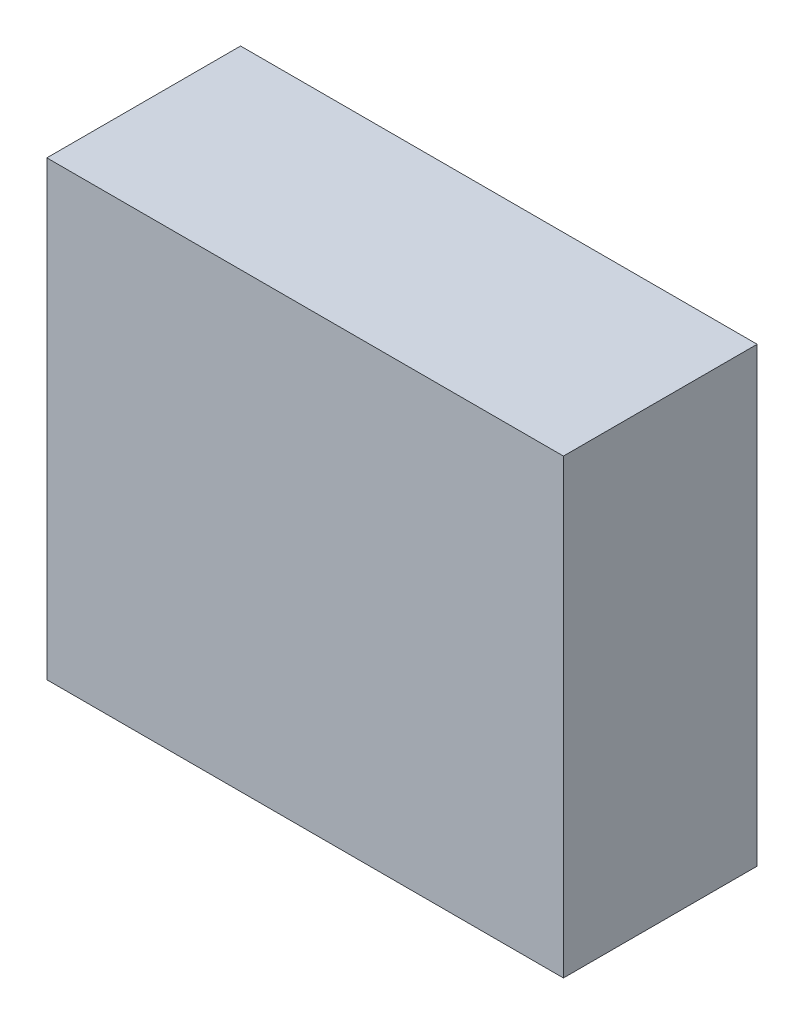
ISO-10303-21;
HEADER;
FILE_DESCRIPTION(('STEP AP214'),'2;1');
FILE_NAME('part.step','',(''),(''),'','','');
FILE_SCHEMA(('AUTOMOTIVE_DESIGN { 1 0 10303 214 1 1 1 1 }'));
ENDSEC;
DATA;
#1=APPLICATION_CONTEXT('core data for automotive mechanical design processes');
#2=APPLICATION_PROTOCOL_DEFINITION('international standard','automotive_design',2000,#1);
#3=PRODUCT_CONTEXT('',#1,'mechanical');
#4=PRODUCT('Part','Part','',(#3));
#5=PRODUCT_RELATED_PRODUCT_CATEGORY('part','',(#4));
#6=PRODUCT_DEFINITION_FORMATION('','',#4);
#7=PRODUCT_DEFINITION_CONTEXT('part definition',#1,'design');
#8=PRODUCT_DEFINITION('design','',#6,#7);
#9=PRODUCT_DEFINITION_SHAPE('','',#8);
#10=(LENGTH_UNIT() NAMED_UNIT(*) SI_UNIT(.MILLI.,.METRE.));
#11=(NAMED_UNIT(*) PLANE_ANGLE_UNIT() SI_UNIT($,.RADIAN.));
#12=(NAMED_UNIT(*) SI_UNIT($,.STERADIAN.) SOLID_ANGLE_UNIT());
#13=UNCERTAINTY_MEASURE_WITH_UNIT(LENGTH_MEASURE(1.E-05),#10,'distance_accuracy_value','');
#14=(GEOMETRIC_REPRESENTATION_CONTEXT(3) GLOBAL_UNCERTAINTY_ASSIGNED_CONTEXT((#13)) GLOBAL_UNIT_ASSIGNED_CONTEXT((#10,
#11,#12)) REPRESENTATION_CONTEXT('',''));
#15=CARTESIAN_POINT('',(0.,0.,0.));
#16=DIRECTION('',(0.,0.,1.));
#17=DIRECTION('',(1.,0.,0.));
#18=AXIS2_PLACEMENT_3D('',#15,#16,#17);
#19=CARTESIAN_POINT('',(-126.,10.5,211.));
#20=DIRECTION('',(0.,0.,1.));
#21=DIRECTION('',(1.,0.,0.));
#22=AXIS2_PLACEMENT_3D('',#19,#20,#21);
#23=PLANE('',#22);
#24=DIRECTION('',(0.,-1.,0.));
#25=VECTOR('',#24,1.);
#26=CARTESIAN_POINT('',(-126.,10.5,211.));
#27=LINE('',#26,#25);
#28=CARTESIAN_POINT('',(-126.,10.5,211.));
#29=VERTEX_POINT('',#28);
#30=CARTESIAN_POINT('',(-126.,-10.5,211.));
#31=VERTEX_POINT('',#30);
#32=EDGE_CURVE('E73',#29,#31,#27,.T.);
#33=ORIENTED_EDGE('',*,*,#32,.F.);
#34=DIRECTION('',(-1.,0.,0.));
#35=VECTOR('',#34,1.);
#36=CARTESIAN_POINT('',(-126.,10.5,211.));
#37=LINE('',#36,#35);
#38=CARTESIAN_POINT('',(-150.,10.5,211.));
#39=VERTEX_POINT('',#38);
#40=EDGE_CURVE('E68',#29,#39,#37,.T.);
#41=ORIENTED_EDGE('',*,*,#40,.T.);
#42=DIRECTION('',(0.,-1.,0.));
#43=VECTOR('',#42,1.);
#44=CARTESIAN_POINT('',(-150.,10.5,211.));
#45=LINE('',#44,#43);
#46=CARTESIAN_POINT('',(-150.,-10.5,211.));
#47=VERTEX_POINT('',#46);
#48=EDGE_CURVE('E70',#39,#47,#45,.T.);
#49=ORIENTED_EDGE('',*,*,#48,.T.);
#50=DIRECTION('',(-1.,0.,0.));
#51=VECTOR('',#50,1.);
#52=CARTESIAN_POINT('',(-126.,-10.5,211.));
#53=LINE('',#52,#51);
#54=EDGE_CURVE('E10',#31,#47,#53,.T.);
#55=ORIENTED_EDGE('',*,*,#54,.F.);
#56=EDGE_LOOP('',(#33,#41,#49,#55));
#57=FACE_BOUND('',#56,.T.);
#58=ADVANCED_FACE('F15',(#57),#23,.T.);
#59=CARTESIAN_POINT('',(-126.,10.5,202.));
#60=DIRECTION('',(0.,0.,1.));
#61=DIRECTION('',(1.,0.,0.));
#62=AXIS2_PLACEMENT_3D('',#59,#60,#61);
#63=PLANE('',#62);
#64=DIRECTION('',(-1.,0.,0.));
#65=VECTOR('',#64,1.);
#66=CARTESIAN_POINT('',(-126.,-10.5,202.));
#67=LINE('',#66,#65);
#68=CARTESIAN_POINT('',(-126.,-10.5,202.));
#69=VERTEX_POINT('',#68);
#70=CARTESIAN_POINT('',(-150.,-10.5,202.));
#71=VERTEX_POINT('',#70);
#72=EDGE_CURVE('E19',#69,#71,#67,.T.);
#73=ORIENTED_EDGE('',*,*,#72,.T.);
#74=DIRECTION('',(0.,-1.,0.));
#75=VECTOR('',#74,1.);
#76=CARTESIAN_POINT('',(-150.,10.5,202.));
#77=LINE('',#76,#75);
#78=CARTESIAN_POINT('',(-150.,10.5,202.));
#79=VERTEX_POINT('',#78);
#80=EDGE_CURVE('E87',#79,#71,#77,.T.);
#81=ORIENTED_EDGE('',*,*,#80,.F.);
#82=DIRECTION('',(-1.,0.,0.));
#83=VECTOR('',#82,1.);
#84=CARTESIAN_POINT('',(-126.,10.5,202.));
#85=LINE('',#84,#83);
#86=CARTESIAN_POINT('',(-126.,10.5,202.));
#87=VERTEX_POINT('',#86);
#88=EDGE_CURVE('E60',#87,#79,#85,.T.);
#89=ORIENTED_EDGE('',*,*,#88,.F.);
#90=DIRECTION('',(0.,-1.,0.));
#91=VECTOR('',#90,1.);
#92=CARTESIAN_POINT('',(-126.,10.5,202.));
#93=LINE('',#92,#91);
#94=EDGE_CURVE('E95',#87,#69,#93,.T.);
#95=ORIENTED_EDGE('',*,*,#94,.T.);
#96=EDGE_LOOP('',(#73,#81,#89,#95));
#97=FACE_BOUND('',#96,.T.);
#98=ADVANCED_FACE('F110',(#97),#63,.F.);
#99=CARTESIAN_POINT('',(-126.,-10.5,202.));
#100=DIRECTION('',(0.,-1.,0.));
#101=DIRECTION('',(0.,0.,-1.));
#102=AXIS2_PLACEMENT_3D('',#99,#100,#101);
#103=PLANE('',#102);
#104=ORIENTED_EDGE('',*,*,#72,.F.);
#105=DIRECTION('',(0.,0.,1.));
#106=VECTOR('',#105,1.);
#107=CARTESIAN_POINT('',(-126.,-10.5,202.));
#108=LINE('',#107,#106);
#109=EDGE_CURVE('E99',#69,#31,#108,.T.);
#110=ORIENTED_EDGE('',*,*,#109,.T.);
#111=ORIENTED_EDGE('',*,*,#54,.T.);
#112=DIRECTION('',(0.,0.,1.));
#113=VECTOR('',#112,1.);
#114=CARTESIAN_POINT('',(-150.,-10.5,202.));
#115=LINE('',#114,#113);
#116=EDGE_CURVE('E82',#71,#47,#115,.T.);
#117=ORIENTED_EDGE('',*,*,#116,.F.);
#118=EDGE_LOOP('',(#104,#110,#111,#117));
#119=FACE_BOUND('',#118,.T.);
#120=ADVANCED_FACE('F17',(#119),#103,.T.);
#121=CARTESIAN_POINT('',(-126.,10.5,202.));
#122=DIRECTION('',(0.,-1.,0.));
#123=DIRECTION('',(0.,0.,-1.));
#124=AXIS2_PLACEMENT_3D('',#121,#122,#123);
#125=PLANE('',#124);
#126=DIRECTION('',(0.,0.,1.));
#127=VECTOR('',#126,1.);
#128=CARTESIAN_POINT('',(-150.,10.5,202.));
#129=LINE('',#128,#127);
#130=EDGE_CURVE('E81',#79,#39,#129,.T.);
#131=ORIENTED_EDGE('',*,*,#130,.T.);
#132=ORIENTED_EDGE('',*,*,#40,.F.);
#133=DIRECTION('',(0.,0.,1.));
#134=VECTOR('',#133,1.);
#135=CARTESIAN_POINT('',(-126.,10.5,202.));
#136=LINE('',#135,#134);
#137=EDGE_CURVE('E88',#87,#29,#136,.T.);
#138=ORIENTED_EDGE('',*,*,#137,.F.);
#139=ORIENTED_EDGE('',*,*,#88,.T.);
#140=EDGE_LOOP('',(#131,#132,#138,#139));
#141=FACE_BOUND('',#140,.T.);
#142=ADVANCED_FACE('F85',(#141),#125,.F.);
#143=CARTESIAN_POINT('',(-150.,10.5,202.));
#144=DIRECTION('',(-1.,0.,0.));
#145=DIRECTION('',(0.,0.,1.));
#146=AXIS2_PLACEMENT_3D('',#143,#144,#145);
#147=PLANE('',#146);
#148=ORIENTED_EDGE('',*,*,#130,.F.);
#149=ORIENTED_EDGE('',*,*,#80,.T.);
#150=ORIENTED_EDGE('',*,*,#116,.T.);
#151=ORIENTED_EDGE('',*,*,#48,.F.);
#152=EDGE_LOOP('',(#148,#149,#150,#151));
#153=FACE_BOUND('',#152,.T.);
#154=ADVANCED_FACE('F79',(#153),#147,.T.);
#155=CARTESIAN_POINT('',(-126.,10.5,202.));
#156=DIRECTION('',(-1.,0.,0.));
#157=DIRECTION('',(0.,0.,1.));
#158=AXIS2_PLACEMENT_3D('',#155,#156,#157);
#159=PLANE('',#158);
#160=ORIENTED_EDGE('',*,*,#32,.T.);
#161=ORIENTED_EDGE('',*,*,#109,.F.);
#162=ORIENTED_EDGE('',*,*,#94,.F.);
#163=ORIENTED_EDGE('',*,*,#137,.T.);
#164=EDGE_LOOP('',(#160,#161,#162,#163));
#165=FACE_BOUND('',#164,.T.);
#166=ADVANCED_FACE('F135',(#165),#159,.F.);
#167=CLOSED_SHELL('',(#58,#98,#120,#142,#154,#166));
#168=MANIFOLD_SOLID_BREP('B1',#167);
#169=ADVANCED_BREP_SHAPE_REPRESENTATION('',(#18,#168),#14);
#170=SHAPE_DEFINITION_REPRESENTATION(#9,#169);
ENDSEC;
END-ISO-10303-21;
